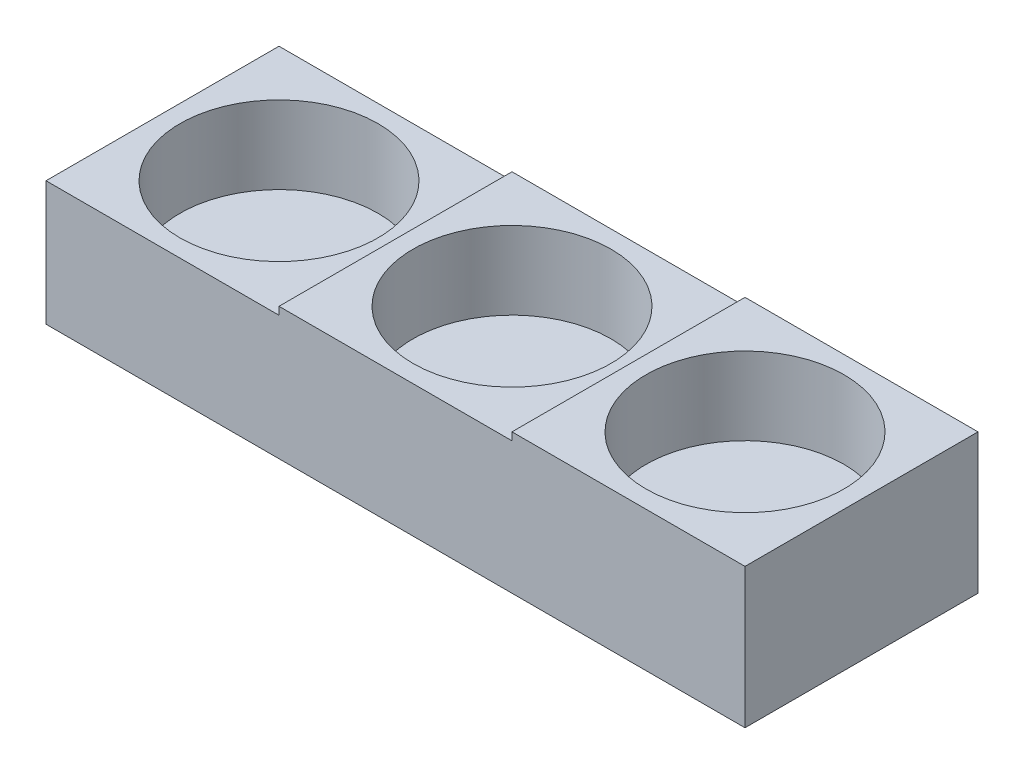
ISO-10303-21;
HEADER;
FILE_DESCRIPTION(('STEP AP214'),'2;1');
FILE_NAME('part.step','',(''),(''),'','','');
FILE_SCHEMA(('AUTOMOTIVE_DESIGN { 1 0 10303 214 1 1 1 1 }'));
ENDSEC;
DATA;
#1=APPLICATION_CONTEXT('core data for automotive mechanical design processes');
#2=APPLICATION_PROTOCOL_DEFINITION('international standard','automotive_design',2000,#1);
#3=PRODUCT_CONTEXT('',#1,'mechanical');
#4=PRODUCT('Part','Part','',(#3));
#5=PRODUCT_RELATED_PRODUCT_CATEGORY('part','',(#4));
#6=PRODUCT_DEFINITION_FORMATION('','',#4);
#7=PRODUCT_DEFINITION_CONTEXT('part definition',#1,'design');
#8=PRODUCT_DEFINITION('design','',#6,#7);
#9=PRODUCT_DEFINITION_SHAPE('','',#8);
#10=(LENGTH_UNIT() NAMED_UNIT(*) SI_UNIT(.MILLI.,.METRE.));
#11=(NAMED_UNIT(*) PLANE_ANGLE_UNIT() SI_UNIT($,.RADIAN.));
#12=(NAMED_UNIT(*) SI_UNIT($,.STERADIAN.) SOLID_ANGLE_UNIT());
#13=UNCERTAINTY_MEASURE_WITH_UNIT(LENGTH_MEASURE(1.E-05),#10,'distance_accuracy_value','');
#14=(GEOMETRIC_REPRESENTATION_CONTEXT(3) GLOBAL_UNCERTAINTY_ASSIGNED_CONTEXT((#13)) GLOBAL_UNIT_ASSIGNED_CONTEXT((#10,
#11,#12)) REPRESENTATION_CONTEXT('',''));
#15=CARTESIAN_POINT('',(0.,0.,0.));
#16=DIRECTION('',(0.,0.,1.));
#17=DIRECTION('',(1.,0.,0.));
#18=AXIS2_PLACEMENT_3D('',#15,#16,#17);
#19=CARTESIAN_POINT('',(0.,0.,0.));
#20=DIRECTION('',(0.,1.,0.));
#21=DIRECTION('',(0.,0.,1.));
#22=AXIS2_PLACEMENT_3D('',#19,#20,#21);
#23=PLANE('',#22);
#24=DIRECTION('',(0.,0.,1.));
#25=VECTOR('',#24,1.);
#26=CARTESIAN_POINT('',(-45.0000000000001,0.,15.));
#27=LINE('',#26,#25);
#28=CARTESIAN_POINT('',(-45.0000000000001,0.,-15.));
#29=VERTEX_POINT('',#28);
#30=CARTESIAN_POINT('',(-45.0000000000001,0.,15.));
#31=VERTEX_POINT('',#30);
#32=EDGE_CURVE('E185',#29,#31,#27,.T.);
#33=ORIENTED_EDGE('',*,*,#32,.F.);
#34=DIRECTION('',(-1.,0.,0.));
#35=VECTOR('',#34,1.);
#36=CARTESIAN_POINT('',(44.9999999999999,0.,-15.));
#37=LINE('',#36,#35);
#38=CARTESIAN_POINT('',(44.9999999999999,0.,-15.));
#39=VERTEX_POINT('',#38);
#40=EDGE_CURVE('E56',#39,#29,#37,.T.);
#41=ORIENTED_EDGE('',*,*,#40,.F.);
#42=DIRECTION('',(0.,0.,-1.));
#43=VECTOR('',#42,1.);
#44=CARTESIAN_POINT('',(44.9999999999999,0.,15.));
#45=LINE('',#44,#43);
#46=CARTESIAN_POINT('',(44.9999999999999,0.,15.));
#47=VERTEX_POINT('',#46);
#48=EDGE_CURVE('E64',#47,#39,#45,.T.);
#49=ORIENTED_EDGE('',*,*,#48,.F.);
#50=DIRECTION('',(1.,0.,0.));
#51=VECTOR('',#50,1.);
#52=CARTESIAN_POINT('',(44.9999999999999,0.,15.));
#53=LINE('',#52,#51);
#54=EDGE_CURVE('E188',#31,#47,#53,.T.);
#55=ORIENTED_EDGE('',*,*,#54,.F.);
#56=EDGE_LOOP('',(#33,#41,#49,#55));
#57=FACE_BOUND('',#56,.T.);
#58=CARTESIAN_POINT('',(-30.,0.,0.));
#59=DIRECTION('',(0.,1.,0.));
#60=DIRECTION('',(0.,0.,1.));
#61=AXIS2_PLACEMENT_3D('',#58,#59,#60);
#62=CIRCLE('',#61,9.);
#63=CARTESIAN_POINT('',(-30.,0.,9.));
#64=VERTEX_POINT('',#63);
#65=EDGE_CURVE('E180',#64,#64,#62,.T.);
#66=ORIENTED_EDGE('',*,*,#65,.T.);
#67=EDGE_LOOP('',(#66));
#68=FACE_BOUND('',#67,.T.);
#69=CARTESIAN_POINT('',(0.,0.,0.));
#70=DIRECTION('',(0.,1.,0.));
#71=DIRECTION('',(0.,0.,1.));
#72=AXIS2_PLACEMENT_3D('',#69,#70,#71);
#73=CIRCLE('',#72,9.);
#74=CARTESIAN_POINT('',(0.,0.,9.));
#75=VERTEX_POINT('',#74);
#76=EDGE_CURVE('E177',#75,#75,#73,.T.);
#77=ORIENTED_EDGE('',*,*,#76,.T.);
#78=EDGE_LOOP('',(#77));
#79=FACE_BOUND('',#78,.T.);
#80=CARTESIAN_POINT('',(30.,0.,0.));
#81=DIRECTION('',(0.,1.,0.));
#82=DIRECTION('',(0.,0.,1.));
#83=AXIS2_PLACEMENT_3D('',#80,#81,#82);
#84=CIRCLE('',#83,9.00000000000002);
#85=CARTESIAN_POINT('',(30.,0.,9.00000000000002));
#86=VERTEX_POINT('',#85);
#87=EDGE_CURVE('E174',#86,#86,#84,.T.);
#88=ORIENTED_EDGE('',*,*,#87,.T.);
#89=EDGE_LOOP('',(#88));
#90=FACE_BOUND('',#89,.T.);
#91=ADVANCED_FACE('F41',(#57,#68,#79,#90),#23,.F.);
#92=CARTESIAN_POINT('',(-45.0000000000001,5.,15.));
#93=DIRECTION('',(1.,0.,0.));
#94=DIRECTION('',(0.,0.,-1.));
#95=AXIS2_PLACEMENT_3D('',#92,#93,#94);
#96=PLANE('',#95);
#97=ORIENTED_EDGE('',*,*,#32,.T.);
#98=DIRECTION('',(0.,-1.,0.));
#99=VECTOR('',#98,1.);
#100=CARTESIAN_POINT('',(-45.0000000000001,5.,15.));
#101=LINE('',#100,#99);
#102=CARTESIAN_POINT('',(-45.0000000000001,16.,15.));
#103=VERTEX_POINT('',#102);
#104=EDGE_CURVE('E198',#103,#31,#101,.T.);
#105=ORIENTED_EDGE('',*,*,#104,.F.);
#106=DIRECTION('',(0.,0.,1.));
#107=VECTOR('',#106,1.);
#108=CARTESIAN_POINT('',(-45.0000000000001,16.,-15.));
#109=LINE('',#108,#107);
#110=CARTESIAN_POINT('',(-45.0000000000001,16.,-15.));
#111=VERTEX_POINT('',#110);
#112=EDGE_CURVE('E161',#111,#103,#109,.T.);
#113=ORIENTED_EDGE('',*,*,#112,.F.);
#114=DIRECTION('',(0.,-1.,0.));
#115=VECTOR('',#114,1.);
#116=CARTESIAN_POINT('',(-45.0000000000001,5.,-15.));
#117=LINE('',#116,#115);
#118=EDGE_CURVE('E192',#111,#29,#117,.T.);
#119=ORIENTED_EDGE('',*,*,#118,.T.);
#120=EDGE_LOOP('',(#97,#105,#113,#119));
#121=FACE_BOUND('',#120,.T.);
#122=ADVANCED_FACE('F43',(#121),#96,.F.);
#123=CARTESIAN_POINT('',(44.9999999999999,5.,15.));
#124=DIRECTION('',(0.,0.,-1.));
#125=DIRECTION('',(-1.,0.,0.));
#126=AXIS2_PLACEMENT_3D('',#123,#124,#125);
#127=PLANE('',#126);
#128=DIRECTION('',(0.,-1.,0.));
#129=VECTOR('',#128,1.);
#130=CARTESIAN_POINT('',(44.9999999999999,5.,15.));
#131=LINE('',#130,#129);
#132=CARTESIAN_POINT('',(44.9999999999999,18.,15.));
#133=VERTEX_POINT('',#132);
#134=EDGE_CURVE('E196',#133,#47,#131,.T.);
#135=ORIENTED_EDGE('',*,*,#134,.F.);
#136=DIRECTION('',(1.,0.,0.));
#137=VECTOR('',#136,1.);
#138=CARTESIAN_POINT('',(0.,18.,15.));
#139=LINE('',#138,#137);
#140=CARTESIAN_POINT('',(14.9999999999999,18.,15.));
#141=VERTEX_POINT('',#140);
#142=EDGE_CURVE('E117',#141,#133,#139,.T.);
#143=ORIENTED_EDGE('',*,*,#142,.F.);
#144=DIRECTION('',(0.,-1.,0.));
#145=VECTOR('',#144,1.);
#146=CARTESIAN_POINT('',(14.9999999999999,18.,15.));
#147=LINE('',#146,#145);
#148=CARTESIAN_POINT('',(14.9999999999999,17.,15.));
#149=VERTEX_POINT('',#148);
#150=EDGE_CURVE('E113',#141,#149,#147,.T.);
#151=ORIENTED_EDGE('',*,*,#150,.T.);
#152=DIRECTION('',(1.,0.,0.));
#153=VECTOR('',#152,1.);
#154=CARTESIAN_POINT('',(14.9999999999999,17.,15.));
#155=LINE('',#154,#153);
#156=CARTESIAN_POINT('',(-15.,17.,15.));
#157=VERTEX_POINT('',#156);
#158=EDGE_CURVE('E141',#157,#149,#155,.T.);
#159=ORIENTED_EDGE('',*,*,#158,.F.);
#160=DIRECTION('',(0.,-1.,0.));
#161=VECTOR('',#160,1.);
#162=CARTESIAN_POINT('',(-15.,17.,15.));
#163=LINE('',#162,#161);
#164=CARTESIAN_POINT('',(-15.,16.,15.));
#165=VERTEX_POINT('',#164);
#166=EDGE_CURVE('E149',#157,#165,#163,.T.);
#167=ORIENTED_EDGE('',*,*,#166,.T.);
#168=DIRECTION('',(1.,0.,0.));
#169=VECTOR('',#168,1.);
#170=CARTESIAN_POINT('',(-15.,16.,15.));
#171=LINE('',#170,#169);
#172=EDGE_CURVE('E164',#103,#165,#171,.T.);
#173=ORIENTED_EDGE('',*,*,#172,.F.);
#174=ORIENTED_EDGE('',*,*,#104,.T.);
#175=ORIENTED_EDGE('',*,*,#54,.T.);
#176=EDGE_LOOP('',(#135,#143,#151,#159,#167,#173,#174,#175));
#177=FACE_BOUND('',#176,.T.);
#178=ADVANCED_FACE('F227',(#177),#127,.F.);
#179=CARTESIAN_POINT('',(44.9999999999999,5.,15.));
#180=DIRECTION('',(-1.,0.,0.));
#181=DIRECTION('',(0.,0.,1.));
#182=AXIS2_PLACEMENT_3D('',#179,#180,#181);
#183=PLANE('',#182);
#184=ORIENTED_EDGE('',*,*,#48,.T.);
#185=DIRECTION('',(0.,-1.,0.));
#186=VECTOR('',#185,1.);
#187=CARTESIAN_POINT('',(44.9999999999999,5.,-15.));
#188=LINE('',#187,#186);
#189=CARTESIAN_POINT('',(44.9999999999999,18.,-15.));
#190=VERTEX_POINT('',#189);
#191=EDGE_CURVE('E194',#190,#39,#188,.T.);
#192=ORIENTED_EDGE('',*,*,#191,.F.);
#193=DIRECTION('',(0.,0.,-1.));
#194=VECTOR('',#193,1.);
#195=CARTESIAN_POINT('',(44.9999999999999,18.,0.));
#196=LINE('',#195,#194);
#197=EDGE_CURVE('E124',#133,#190,#196,.T.);
#198=ORIENTED_EDGE('',*,*,#197,.F.);
#199=ORIENTED_EDGE('',*,*,#134,.T.);
#200=EDGE_LOOP('',(#184,#192,#198,#199));
#201=FACE_BOUND('',#200,.T.);
#202=ADVANCED_FACE('F237',(#201),#183,.F.);
#203=CARTESIAN_POINT('',(44.9999999999999,5.,-15.));
#204=DIRECTION('',(0.,0.,1.));
#205=DIRECTION('',(1.,0.,0.));
#206=AXIS2_PLACEMENT_3D('',#203,#204,#205);
#207=PLANE('',#206);
#208=ORIENTED_EDGE('',*,*,#118,.F.);
#209=DIRECTION('',(-1.,0.,0.));
#210=VECTOR('',#209,1.);
#211=CARTESIAN_POINT('',(-15.,16.,-15.));
#212=LINE('',#211,#210);
#213=CARTESIAN_POINT('',(-15.,16.,-15.));
#214=VERTEX_POINT('',#213);
#215=EDGE_CURVE('E158',#214,#111,#212,.T.);
#216=ORIENTED_EDGE('',*,*,#215,.F.);
#217=DIRECTION('',(0.,-1.,0.));
#218=VECTOR('',#217,1.);
#219=CARTESIAN_POINT('',(-15.,17.,-15.));
#220=LINE('',#219,#218);
#221=CARTESIAN_POINT('',(-15.,17.,-15.));
#222=VERTEX_POINT('',#221);
#223=EDGE_CURVE('E147',#222,#214,#220,.T.);
#224=ORIENTED_EDGE('',*,*,#223,.F.);
#225=DIRECTION('',(-1.,0.,0.));
#226=VECTOR('',#225,1.);
#227=CARTESIAN_POINT('',(14.9999999999999,17.,-15.));
#228=LINE('',#227,#226);
#229=CARTESIAN_POINT('',(14.9999999999999,17.,-15.));
#230=VERTEX_POINT('',#229);
#231=EDGE_CURVE('E130',#230,#222,#228,.T.);
#232=ORIENTED_EDGE('',*,*,#231,.F.);
#233=DIRECTION('',(0.,-1.,0.));
#234=VECTOR('',#233,1.);
#235=CARTESIAN_POINT('',(14.9999999999999,18.,-15.));
#236=LINE('',#235,#234);
#237=CARTESIAN_POINT('',(14.9999999999999,18.,-15.));
#238=VERTEX_POINT('',#237);
#239=EDGE_CURVE('E110',#238,#230,#236,.T.);
#240=ORIENTED_EDGE('',*,*,#239,.F.);
#241=DIRECTION('',(-1.,0.,0.));
#242=VECTOR('',#241,1.);
#243=CARTESIAN_POINT('',(0.,18.,-15.));
#244=LINE('',#243,#242);
#245=EDGE_CURVE('E118',#190,#238,#244,.T.);
#246=ORIENTED_EDGE('',*,*,#245,.F.);
#247=ORIENTED_EDGE('',*,*,#191,.T.);
#248=ORIENTED_EDGE('',*,*,#40,.T.);
#249=EDGE_LOOP('',(#208,#216,#224,#232,#240,#246,#247,#248));
#250=FACE_BOUND('',#249,.T.);
#251=ADVANCED_FACE('F128',(#250),#207,.F.);
#252=CARTESIAN_POINT('',(-30.,5.,0.));
#253=DIRECTION('',(0.,-1.,0.));
#254=DIRECTION('',(0.,0.,-1.));
#255=AXIS2_PLACEMENT_3D('',#252,#253,#254);
#256=CYLINDRICAL_SURFACE('',#255,9.);
#257=CARTESIAN_POINT('',(-30.,5.,0.));
#258=DIRECTION('',(0.,1.,0.));
#259=DIRECTION('',(0.,0.,1.));
#260=AXIS2_PLACEMENT_3D('',#257,#258,#259);
#261=CIRCLE('',#260,9.);
#262=CARTESIAN_POINT('',(-30.,5.,9.));
#263=VERTEX_POINT('',#262);
#264=EDGE_CURVE('E173',#263,#263,#261,.T.);
#265=ORIENTED_EDGE('',*,*,#264,.T.);
#266=EDGE_LOOP('',(#265));
#267=FACE_BOUND('',#266,.T.);
#268=ORIENTED_EDGE('',*,*,#65,.F.);
#269=EDGE_LOOP('',(#268));
#270=FACE_BOUND('',#269,.T.);
#271=ADVANCED_FACE('F233',(#267,#270),#256,.F.);
#272=CARTESIAN_POINT('',(0.,5.,0.));
#273=DIRECTION('',(0.,-1.,0.));
#274=DIRECTION('',(0.,0.,-1.));
#275=AXIS2_PLACEMENT_3D('',#272,#273,#274);
#276=CYLINDRICAL_SURFACE('',#275,9.);
#277=CARTESIAN_POINT('',(0.,5.,0.));
#278=DIRECTION('',(0.,1.,0.));
#279=DIRECTION('',(0.,0.,1.));
#280=AXIS2_PLACEMENT_3D('',#277,#278,#279);
#281=CIRCLE('',#280,9.);
#282=CARTESIAN_POINT('',(0.,5.,9.));
#283=VERTEX_POINT('',#282);
#284=EDGE_CURVE('E170',#283,#283,#281,.T.);
#285=ORIENTED_EDGE('',*,*,#284,.T.);
#286=EDGE_LOOP('',(#285));
#287=FACE_BOUND('',#286,.T.);
#288=ORIENTED_EDGE('',*,*,#76,.F.);
#289=EDGE_LOOP('',(#288));
#290=FACE_BOUND('',#289,.T.);
#291=ADVANCED_FACE('F296',(#287,#290),#276,.F.);
#292=CARTESIAN_POINT('',(30.,5.,0.));
#293=DIRECTION('',(0.,-1.,0.));
#294=DIRECTION('',(0.,0.,-1.));
#295=AXIS2_PLACEMENT_3D('',#292,#293,#294);
#296=CYLINDRICAL_SURFACE('',#295,9.00000000000002);
#297=CARTESIAN_POINT('',(30.,5.,0.));
#298=DIRECTION('',(0.,-1.,0.));
#299=DIRECTION('',(0.,0.,-1.));
#300=AXIS2_PLACEMENT_3D('',#297,#298,#299);
#301=CIRCLE('',#300,9.00000000000002);
#302=CARTESIAN_POINT('',(30.,5.,-9.00000000000002));
#303=VERTEX_POINT('',#302);
#304=EDGE_CURVE('E167',#303,#303,#301,.T.);
#305=ORIENTED_EDGE('',*,*,#304,.F.);
#306=EDGE_LOOP('',(#305));
#307=FACE_BOUND('',#306,.T.);
#308=ORIENTED_EDGE('',*,*,#87,.F.);
#309=EDGE_LOOP('',(#308));
#310=FACE_BOUND('',#309,.T.);
#311=ADVANCED_FACE('F292',(#307,#310),#296,.F.);
#312=CARTESIAN_POINT('',(0.,5.,0.));
#313=DIRECTION('',(0.,1.,0.));
#314=DIRECTION('',(0.,0.,1.));
#315=AXIS2_PLACEMENT_3D('',#312,#313,#314);
#316=PLANE('',#315);
#317=ORIENTED_EDGE('',*,*,#264,.F.);
#318=EDGE_LOOP('',(#317));
#319=FACE_BOUND('',#318,.T.);
#320=ADVANCED_FACE('F287',(#319),#316,.F.);
#321=CARTESIAN_POINT('',(0.,5.,0.));
#322=DIRECTION('',(0.,1.,0.));
#323=DIRECTION('',(0.,0.,1.));
#324=AXIS2_PLACEMENT_3D('',#321,#322,#323);
#325=PLANE('',#324);
#326=ORIENTED_EDGE('',*,*,#284,.F.);
#327=EDGE_LOOP('',(#326));
#328=FACE_BOUND('',#327,.T.);
#329=ADVANCED_FACE('F282',(#328),#325,.F.);
#330=CARTESIAN_POINT('',(0.,5.,0.));
#331=DIRECTION('',(0.,-1.,0.));
#332=DIRECTION('',(0.,0.,-1.));
#333=AXIS2_PLACEMENT_3D('',#330,#331,#332);
#334=PLANE('',#333);
#335=ORIENTED_EDGE('',*,*,#304,.T.);
#336=EDGE_LOOP('',(#335));
#337=FACE_BOUND('',#336,.T.);
#338=ADVANCED_FACE('F277',(#337),#334,.T.);
#339=CARTESIAN_POINT('',(0.,16.,0.));
#340=DIRECTION('',(0.,-1.,0.));
#341=DIRECTION('',(0.,0.,-1.));
#342=AXIS2_PLACEMENT_3D('',#339,#340,#341);
#343=PLANE('',#342);
#344=DIRECTION('',(0.,0.,-1.));
#345=VECTOR('',#344,1.);
#346=CARTESIAN_POINT('',(-15.,16.,-15.));
#347=LINE('',#346,#345);
#348=EDGE_CURVE('E155',#165,#214,#347,.T.);
#349=ORIENTED_EDGE('',*,*,#348,.T.);
#350=ORIENTED_EDGE('',*,*,#215,.T.);
#351=ORIENTED_EDGE('',*,*,#112,.T.);
#352=ORIENTED_EDGE('',*,*,#172,.T.);
#353=EDGE_LOOP('',(#349,#350,#351,#352));
#354=FACE_BOUND('',#353,.T.);
#355=CARTESIAN_POINT('',(-30.,16.,0.));
#356=DIRECTION('',(0.,1.,0.));
#357=DIRECTION('',(0.,0.,1.));
#358=AXIS2_PLACEMENT_3D('',#355,#356,#357);
#359=CIRCLE('',#358,12.75);
#360=CARTESIAN_POINT('',(-30.,16.,12.75));
#361=VERTEX_POINT('',#360);
#362=EDGE_CURVE('E152',#361,#361,#359,.T.);
#363=ORIENTED_EDGE('',*,*,#362,.F.);
#364=EDGE_LOOP('',(#363));
#365=FACE_BOUND('',#364,.T.);
#366=ADVANCED_FACE('F216',(#354,#365),#343,.F.);
#367=CARTESIAN_POINT('',(-30.,16.,0.));
#368=DIRECTION('',(0.,-1.,0.));
#369=DIRECTION('',(0.,0.,-1.));
#370=AXIS2_PLACEMENT_3D('',#367,#368,#369);
#371=CYLINDRICAL_SURFACE('',#370,12.75);
#372=ORIENTED_EDGE('',*,*,#362,.T.);
#373=EDGE_LOOP('',(#372));
#374=FACE_BOUND('',#373,.T.);
#375=CARTESIAN_POINT('',(-30.,6.,0.));
#376=DIRECTION('',(0.,1.,0.));
#377=DIRECTION('',(0.,0.,1.));
#378=AXIS2_PLACEMENT_3D('',#375,#376,#377);
#379=CIRCLE('',#378,12.75);
#380=CARTESIAN_POINT('',(-30.,6.,12.75));
#381=VERTEX_POINT('',#380);
#382=EDGE_CURVE('E49',#381,#381,#379,.F.);
#383=ORIENTED_EDGE('',*,*,#382,.T.);
#384=EDGE_LOOP('',(#383));
#385=FACE_BOUND('',#384,.T.);
#386=ADVANCED_FACE('F203',(#374,#385),#371,.F.);
#387=CARTESIAN_POINT('',(0.,6.,0.));
#388=DIRECTION('',(0.,1.,0.));
#389=DIRECTION('',(0.,0.,1.));
#390=AXIS2_PLACEMENT_3D('',#387,#388,#389);
#391=PLANE('',#390);
#392=ORIENTED_EDGE('',*,*,#382,.F.);
#393=EDGE_LOOP('',(#392));
#394=FACE_BOUND('',#393,.T.);
#395=ADVANCED_FACE('F205',(#394),#391,.T.);
#396=CARTESIAN_POINT('',(-15.,17.,15.));
#397=DIRECTION('',(1.,0.,0.));
#398=DIRECTION('',(0.,0.,-1.));
#399=AXIS2_PLACEMENT_3D('',#396,#397,#398);
#400=PLANE('',#399);
#401=ORIENTED_EDGE('',*,*,#223,.T.);
#402=ORIENTED_EDGE('',*,*,#348,.F.);
#403=ORIENTED_EDGE('',*,*,#166,.F.);
#404=DIRECTION('',(0.,0.,1.));
#405=VECTOR('',#404,1.);
#406=CARTESIAN_POINT('',(-15.,17.,15.));
#407=LINE('',#406,#405);
#408=EDGE_CURVE('E134',#222,#157,#407,.T.);
#409=ORIENTED_EDGE('',*,*,#408,.F.);
#410=EDGE_LOOP('',(#401,#402,#403,#409));
#411=FACE_BOUND('',#410,.T.);
#412=ADVANCED_FACE('F207',(#411),#400,.F.);
#413=CARTESIAN_POINT('',(0.,17.,0.));
#414=DIRECTION('',(0.,1.,0.));
#415=DIRECTION('',(0.,0.,1.));
#416=AXIS2_PLACEMENT_3D('',#413,#414,#415);
#417=PLANE('',#416);
#418=ORIENTED_EDGE('',*,*,#408,.T.);
#419=ORIENTED_EDGE('',*,*,#158,.T.);
#420=DIRECTION('',(0.,0.,-1.));
#421=VECTOR('',#420,1.);
#422=CARTESIAN_POINT('',(14.9999999999999,17.,15.));
#423=LINE('',#422,#421);
#424=EDGE_CURVE('E144',#149,#230,#423,.T.);
#425=ORIENTED_EDGE('',*,*,#424,.T.);
#426=ORIENTED_EDGE('',*,*,#231,.T.);
#427=EDGE_LOOP('',(#418,#419,#425,#426));
#428=FACE_BOUND('',#427,.T.);
#429=CARTESIAN_POINT('',(0.,17.,0.));
#430=DIRECTION('',(0.,1.,0.));
#431=DIRECTION('',(0.,0.,1.));
#432=AXIS2_PLACEMENT_3D('',#429,#430,#431);
#433=CIRCLE('',#432,12.75);
#434=CARTESIAN_POINT('',(0.,17.,12.75));
#435=VERTEX_POINT('',#434);
#436=EDGE_CURVE('E131',#435,#435,#433,.T.);
#437=ORIENTED_EDGE('',*,*,#436,.F.);
#438=EDGE_LOOP('',(#437));
#439=FACE_BOUND('',#438,.T.);
#440=ADVANCED_FACE('F213',(#428,#439),#417,.T.);
#441=CARTESIAN_POINT('',(0.,17.,0.));
#442=DIRECTION('',(0.,-1.,0.));
#443=DIRECTION('',(0.,0.,-1.));
#444=AXIS2_PLACEMENT_3D('',#441,#442,#443);
#445=CYLINDRICAL_SURFACE('',#444,12.75);
#446=ORIENTED_EDGE('',*,*,#436,.T.);
#447=EDGE_LOOP('',(#446));
#448=FACE_BOUND('',#447,.T.);
#449=CARTESIAN_POINT('',(0.,7.,0.));
#450=DIRECTION('',(0.,1.,0.));
#451=DIRECTION('',(0.,0.,1.));
#452=AXIS2_PLACEMENT_3D('',#449,#450,#451);
#453=CIRCLE('',#452,12.75);
#454=CARTESIAN_POINT('',(0.,7.,12.75));
#455=VERTEX_POINT('',#454);
#456=EDGE_CURVE('E11',#455,#455,#453,.F.);
#457=ORIENTED_EDGE('',*,*,#456,.T.);
#458=EDGE_LOOP('',(#457));
#459=FACE_BOUND('',#458,.T.);
#460=ADVANCED_FACE('F269',(#448,#459),#445,.F.);
#461=CARTESIAN_POINT('',(0.,7.,0.));
#462=DIRECTION('',(0.,1.,0.));
#463=DIRECTION('',(0.,0.,1.));
#464=AXIS2_PLACEMENT_3D('',#461,#462,#463);
#465=PLANE('',#464);
#466=ORIENTED_EDGE('',*,*,#456,.F.);
#467=EDGE_LOOP('',(#466));
#468=FACE_BOUND('',#467,.T.);
#469=ADVANCED_FACE('F267',(#468),#465,.T.);
#470=CARTESIAN_POINT('',(15.,18.,0.));
#471=DIRECTION('',(1.,0.,0.));
#472=DIRECTION('',(0.,0.,-1.));
#473=AXIS2_PLACEMENT_3D('',#470,#471,#472);
#474=PLANE('',#473);
#475=ORIENTED_EDGE('',*,*,#424,.F.);
#476=ORIENTED_EDGE('',*,*,#150,.F.);
#477=DIRECTION('',(0.,0.,1.));
#478=VECTOR('',#477,1.);
#479=CARTESIAN_POINT('',(15.,18.,0.));
#480=LINE('',#479,#478);
#481=EDGE_CURVE('E106',#238,#141,#480,.T.);
#482=ORIENTED_EDGE('',*,*,#481,.F.);
#483=ORIENTED_EDGE('',*,*,#239,.T.);
#484=EDGE_LOOP('',(#475,#476,#482,#483));
#485=FACE_BOUND('',#484,.T.);
#486=ADVANCED_FACE('F108',(#485),#474,.F.);
#487=CARTESIAN_POINT('',(30.,18.,0.));
#488=DIRECTION('',(0.,-1.,0.));
#489=DIRECTION('',(0.,0.,-1.));
#490=AXIS2_PLACEMENT_3D('',#487,#488,#489);
#491=CYLINDRICAL_SURFACE('',#490,12.75);
#492=CARTESIAN_POINT('',(30.,18.,0.));
#493=DIRECTION('',(0.,1.,0.));
#494=DIRECTION('',(0.,0.,1.));
#495=AXIS2_PLACEMENT_3D('',#492,#493,#494);
#496=CIRCLE('',#495,12.75);
#497=CARTESIAN_POINT('',(30.,18.,12.75));
#498=VERTEX_POINT('',#497);
#499=EDGE_CURVE('E125',#498,#498,#496,.T.);
#500=ORIENTED_EDGE('',*,*,#499,.T.);
#501=EDGE_LOOP('',(#500));
#502=FACE_BOUND('',#501,.T.);
#503=CARTESIAN_POINT('',(30.,8.,0.));
#504=DIRECTION('',(0.,1.,0.));
#505=DIRECTION('',(0.,0.,1.));
#506=AXIS2_PLACEMENT_3D('',#503,#504,#505);
#507=CIRCLE('',#506,12.75);
#508=CARTESIAN_POINT('',(30.,8.,12.75));
#509=VERTEX_POINT('',#508);
#510=EDGE_CURVE('E245',#509,#509,#507,.T.);
#511=ORIENTED_EDGE('',*,*,#510,.F.);
#512=EDGE_LOOP('',(#511));
#513=FACE_BOUND('',#512,.T.);
#514=ADVANCED_FACE('F253',(#502,#513),#491,.F.);
#515=CARTESIAN_POINT('',(0.,18.,0.));
#516=DIRECTION('',(0.,1.,0.));
#517=DIRECTION('',(0.,0.,1.));
#518=AXIS2_PLACEMENT_3D('',#515,#516,#517);
#519=PLANE('',#518);
#520=ORIENTED_EDGE('',*,*,#499,.F.);
#521=EDGE_LOOP('',(#520));
#522=FACE_BOUND('',#521,.T.);
#523=ORIENTED_EDGE('',*,*,#245,.T.);
#524=ORIENTED_EDGE('',*,*,#481,.T.);
#525=ORIENTED_EDGE('',*,*,#142,.T.);
#526=ORIENTED_EDGE('',*,*,#197,.T.);
#527=EDGE_LOOP('',(#523,#524,#525,#526));
#528=FACE_BOUND('',#527,.T.);
#529=ADVANCED_FACE('F122',(#522,#528),#519,.T.);
#530=CARTESIAN_POINT('',(0.,8.,0.));
#531=DIRECTION('',(0.,-1.,0.));
#532=DIRECTION('',(0.,0.,-1.));
#533=AXIS2_PLACEMENT_3D('',#530,#531,#532);
#534=PLANE('',#533);
#535=ORIENTED_EDGE('',*,*,#510,.T.);
#536=EDGE_LOOP('',(#535));
#537=FACE_BOUND('',#536,.T.);
#538=ADVANCED_FACE('F257',(#537),#534,.F.);
#539=CLOSED_SHELL('',(#91,#122,#178,#202,#251,#271,#291,#311,#320,#329,#338,#366,#386,#395,#412,
#440,#460,#469,#486,#514,#529,#538));
#540=MANIFOLD_SOLID_BREP('B2',#539);
#541=ADVANCED_BREP_SHAPE_REPRESENTATION('',(#18,#540),#14);
#542=SHAPE_DEFINITION_REPRESENTATION(#9,#541);
ENDSEC;
END-ISO-10303-21;
